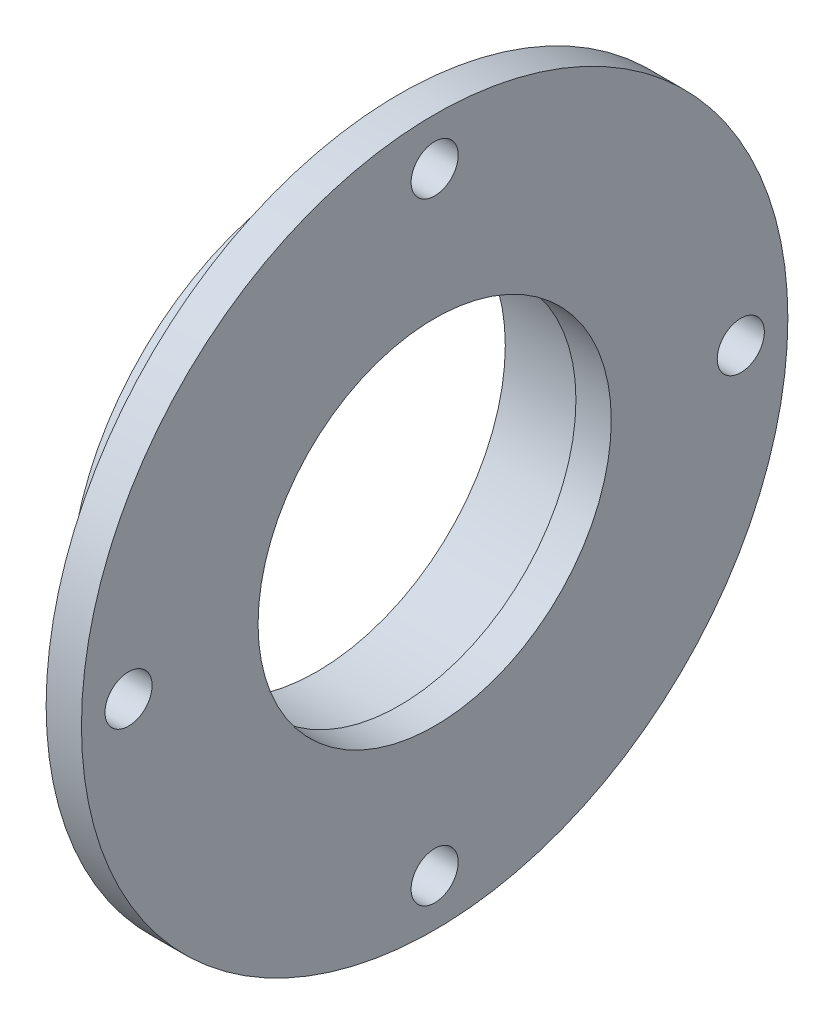
ISO-10303-21;
HEADER;
FILE_DESCRIPTION(('STEP AP214'),'2;1');
FILE_NAME('part.step','',(''),(''),'','','');
FILE_SCHEMA(('AUTOMOTIVE_DESIGN { 1 0 10303 214 1 1 1 1 }'));
ENDSEC;
DATA;
#1=APPLICATION_CONTEXT('core data for automotive mechanical design processes');
#2=APPLICATION_PROTOCOL_DEFINITION('international standard','automotive_design',2000,#1);
#3=PRODUCT_CONTEXT('',#1,'mechanical');
#4=PRODUCT('Part','Part','',(#3));
#5=PRODUCT_RELATED_PRODUCT_CATEGORY('part','',(#4));
#6=PRODUCT_DEFINITION_FORMATION('','',#4);
#7=PRODUCT_DEFINITION_CONTEXT('part definition',#1,'design');
#8=PRODUCT_DEFINITION('design','',#6,#7);
#9=PRODUCT_DEFINITION_SHAPE('','',#8);
#10=(LENGTH_UNIT() NAMED_UNIT(*) SI_UNIT(.MILLI.,.METRE.));
#11=(NAMED_UNIT(*) PLANE_ANGLE_UNIT() SI_UNIT($,.RADIAN.));
#12=(NAMED_UNIT(*) SI_UNIT($,.STERADIAN.) SOLID_ANGLE_UNIT());
#13=UNCERTAINTY_MEASURE_WITH_UNIT(LENGTH_MEASURE(1.E-05),#10,'distance_accuracy_value','');
#14=(GEOMETRIC_REPRESENTATION_CONTEXT(3) GLOBAL_UNCERTAINTY_ASSIGNED_CONTEXT((#13)) GLOBAL_UNIT_ASSIGNED_CONTEXT((#10,
#11,#12)) REPRESENTATION_CONTEXT('',''));
#15=CARTESIAN_POINT('',(0.,0.,0.));
#16=DIRECTION('',(0.,0.,1.));
#17=DIRECTION('',(1.,0.,0.));
#18=AXIS2_PLACEMENT_3D('',#15,#16,#17);
#19=CARTESIAN_POINT('',(10.,0.,0.));
#20=DIRECTION('',(-1.,0.,0.));
#21=DIRECTION('',(0.,0.,1.));
#22=AXIS2_PLACEMENT_3D('',#19,#20,#21);
#23=CYLINDRICAL_SURFACE('',#22,16.);
#24=CARTESIAN_POINT('',(0.,0.,0.));
#25=DIRECTION('',(-1.,0.,0.));
#26=DIRECTION('',(0.,0.,1.));
#27=AXIS2_PLACEMENT_3D('',#24,#25,#26);
#28=CIRCLE('',#27,16.);
#29=CARTESIAN_POINT('',(0.,0.,16.));
#30=VERTEX_POINT('',#29);
#31=EDGE_CURVE('E62',#30,#30,#28,.T.);
#32=ORIENTED_EDGE('',*,*,#31,.T.);
#33=EDGE_LOOP('',(#32));
#34=FACE_BOUND('',#33,.T.);
#35=CARTESIAN_POINT('',(7.,0.,0.));
#36=DIRECTION('',(1.,0.,0.));
#37=DIRECTION('',(0.,0.,-1.));
#38=AXIS2_PLACEMENT_3D('',#35,#36,#37);
#39=CIRCLE('',#38,16.);
#40=CARTESIAN_POINT('',(7.,0.,-16.));
#41=VERTEX_POINT('',#40);
#42=EDGE_CURVE('E10',#41,#41,#39,.F.);
#43=ORIENTED_EDGE('',*,*,#42,.F.);
#44=EDGE_LOOP('',(#43));
#45=FACE_BOUND('',#44,.T.);
#46=ADVANCED_FACE('F41',(#34,#45),#23,.F.);
#47=CARTESIAN_POINT('',(7.,0.,0.));
#48=DIRECTION('',(-1.,0.,0.));
#49=DIRECTION('',(0.,0.,1.));
#50=AXIS2_PLACEMENT_3D('',#47,#48,#49);
#51=CYLINDRICAL_SURFACE('',#50,21.);
#52=CARTESIAN_POINT('',(7.,0.,0.));
#53=DIRECTION('',(1.,0.,0.));
#54=DIRECTION('',(0.,0.,-1.));
#55=AXIS2_PLACEMENT_3D('',#52,#53,#54);
#56=CIRCLE('',#55,21.);
#57=CARTESIAN_POINT('',(7.,0.,-21.));
#58=VERTEX_POINT('',#57);
#59=EDGE_CURVE('E48',#58,#58,#56,.T.);
#60=ORIENTED_EDGE('',*,*,#59,.F.);
#61=EDGE_LOOP('',(#60));
#62=FACE_BOUND('',#61,.T.);
#63=CARTESIAN_POINT('',(0.,0.,0.));
#64=DIRECTION('',(1.,0.,0.));
#65=DIRECTION('',(0.,0.,-1.));
#66=AXIS2_PLACEMENT_3D('',#63,#64,#65);
#67=CIRCLE('',#66,21.);
#68=CARTESIAN_POINT('',(0.,0.,-21.));
#69=VERTEX_POINT('',#68);
#70=EDGE_CURVE('E52',#69,#69,#67,.T.);
#71=ORIENTED_EDGE('',*,*,#70,.T.);
#72=EDGE_LOOP('',(#71));
#73=FACE_BOUND('',#72,.T.);
#74=ADVANCED_FACE('F43',(#62,#73),#51,.T.);
#75=CARTESIAN_POINT('',(0.,0.,0.));
#76=DIRECTION('',(1.,0.,0.));
#77=DIRECTION('',(0.,0.,-1.));
#78=AXIS2_PLACEMENT_3D('',#75,#76,#77);
#79=PLANE('',#78);
#80=CARTESIAN_POINT('',(0.,18.5,0.));
#81=DIRECTION('',(-1.,0.,0.));
#82=DIRECTION('',(0.,0.,1.));
#83=AXIS2_PLACEMENT_3D('',#80,#81,#82);
#84=CIRCLE('',#83,1.5);
#85=CARTESIAN_POINT('',(0.,18.5,1.5));
#86=VERTEX_POINT('',#85);
#87=EDGE_CURVE('E87',#86,#86,#84,.T.);
#88=ORIENTED_EDGE('',*,*,#87,.F.);
#89=EDGE_LOOP('',(#88));
#90=FACE_BOUND('',#89,.T.);
#91=CARTESIAN_POINT('',(0.,0.,18.5));
#92=DIRECTION('',(-1.,0.,0.));
#93=DIRECTION('',(0.,0.,1.));
#94=AXIS2_PLACEMENT_3D('',#91,#92,#93);
#95=CIRCLE('',#94,1.5);
#96=CARTESIAN_POINT('',(0.,0.,20.));
#97=VERTEX_POINT('',#96);
#98=EDGE_CURVE('E84',#97,#97,#95,.T.);
#99=ORIENTED_EDGE('',*,*,#98,.F.);
#100=EDGE_LOOP('',(#99));
#101=FACE_BOUND('',#100,.T.);
#102=CARTESIAN_POINT('',(0.,-18.5,0.));
#103=DIRECTION('',(-1.,0.,0.));
#104=DIRECTION('',(0.,0.,1.));
#105=AXIS2_PLACEMENT_3D('',#102,#103,#104);
#106=CIRCLE('',#105,1.5);
#107=CARTESIAN_POINT('',(0.,-18.5,1.5));
#108=VERTEX_POINT('',#107);
#109=EDGE_CURVE('E78',#108,#108,#106,.T.);
#110=ORIENTED_EDGE('',*,*,#109,.F.);
#111=EDGE_LOOP('',(#110));
#112=FACE_BOUND('',#111,.T.);
#113=CARTESIAN_POINT('',(0.,0.,-18.5));
#114=DIRECTION('',(-1.,0.,0.));
#115=DIRECTION('',(0.,0.,1.));
#116=AXIS2_PLACEMENT_3D('',#113,#114,#115);
#117=CIRCLE('',#116,1.5);
#118=CARTESIAN_POINT('',(0.,0.,-17.));
#119=VERTEX_POINT('',#118);
#120=EDGE_CURVE('E71',#119,#119,#117,.T.);
#121=ORIENTED_EDGE('',*,*,#120,.F.);
#122=EDGE_LOOP('',(#121));
#123=FACE_BOUND('',#122,.T.);
#124=ORIENTED_EDGE('',*,*,#31,.F.);
#125=EDGE_LOOP('',(#124));
#126=FACE_BOUND('',#125,.T.);
#127=ORIENTED_EDGE('',*,*,#70,.F.);
#128=EDGE_LOOP('',(#127));
#129=FACE_BOUND('',#128,.T.);
#130=ADVANCED_FACE('F147',(#90,#101,#112,#123,#126,#129),#79,.F.);
#131=CARTESIAN_POINT('',(10.,0.,0.));
#132=DIRECTION('',(-1.,0.,0.));
#133=DIRECTION('',(0.,0.,1.));
#134=AXIS2_PLACEMENT_3D('',#131,#132,#133);
#135=CYLINDRICAL_SURFACE('',#134,30.);
#136=CARTESIAN_POINT('',(10.,0.,0.));
#137=DIRECTION('',(1.,0.,0.));
#138=DIRECTION('',(0.,0.,-1.));
#139=AXIS2_PLACEMENT_3D('',#136,#137,#138);
#140=CIRCLE('',#139,30.);
#141=CARTESIAN_POINT('',(10.,0.,-30.));
#142=VERTEX_POINT('',#141);
#143=EDGE_CURVE('E57',#142,#142,#140,.T.);
#144=ORIENTED_EDGE('',*,*,#143,.F.);
#145=EDGE_LOOP('',(#144));
#146=FACE_BOUND('',#145,.T.);
#147=CARTESIAN_POINT('',(7.,0.,0.));
#148=DIRECTION('',(1.,0.,0.));
#149=DIRECTION('',(0.,0.,-1.));
#150=AXIS2_PLACEMENT_3D('',#147,#148,#149);
#151=CIRCLE('',#150,30.);
#152=CARTESIAN_POINT('',(7.,0.,-30.));
#153=VERTEX_POINT('',#152);
#154=EDGE_CURVE('E59',#153,#153,#151,.T.);
#155=ORIENTED_EDGE('',*,*,#154,.T.);
#156=EDGE_LOOP('',(#155));
#157=FACE_BOUND('',#156,.T.);
#158=ADVANCED_FACE('F145',(#146,#157),#135,.T.);
#159=CARTESIAN_POINT('',(10.,0.,0.));
#160=DIRECTION('',(1.,0.,0.));
#161=DIRECTION('',(0.,0.,-1.));
#162=AXIS2_PLACEMENT_3D('',#159,#160,#161);
#163=PLANE('',#162);
#164=CARTESIAN_POINT('',(10.,26.,0.));
#165=DIRECTION('',(-1.,0.,0.));
#166=DIRECTION('',(0.,0.,1.));
#167=AXIS2_PLACEMENT_3D('',#164,#165,#166);
#168=CIRCLE('',#167,2.);
#169=CARTESIAN_POINT('',(10.,26.,2.));
#170=VERTEX_POINT('',#169);
#171=EDGE_CURVE('E95',#170,#170,#168,.T.);
#172=ORIENTED_EDGE('',*,*,#171,.T.);
#173=EDGE_LOOP('',(#172));
#174=FACE_BOUND('',#173,.T.);
#175=CARTESIAN_POINT('',(10.,0.,26.));
#176=DIRECTION('',(-1.,0.,0.));
#177=DIRECTION('',(0.,0.,1.));
#178=AXIS2_PLACEMENT_3D('',#175,#176,#177);
#179=CIRCLE('',#178,2.);
#180=CARTESIAN_POINT('',(10.,0.,28.));
#181=VERTEX_POINT('',#180);
#182=EDGE_CURVE('E110',#181,#181,#179,.T.);
#183=ORIENTED_EDGE('',*,*,#182,.T.);
#184=EDGE_LOOP('',(#183));
#185=FACE_BOUND('',#184,.T.);
#186=CARTESIAN_POINT('',(10.,-26.,0.));
#187=DIRECTION('',(-1.,0.,0.));
#188=DIRECTION('',(0.,0.,1.));
#189=AXIS2_PLACEMENT_3D('',#186,#187,#188);
#190=CIRCLE('',#189,2.);
#191=CARTESIAN_POINT('',(10.,-26.,2.));
#192=VERTEX_POINT('',#191);
#193=EDGE_CURVE('E104',#192,#192,#190,.T.);
#194=ORIENTED_EDGE('',*,*,#193,.T.);
#195=EDGE_LOOP('',(#194));
#196=FACE_BOUND('',#195,.T.);
#197=CARTESIAN_POINT('',(10.,0.,-26.));
#198=DIRECTION('',(-1.,0.,0.));
#199=DIRECTION('',(0.,0.,1.));
#200=AXIS2_PLACEMENT_3D('',#197,#198,#199);
#201=CIRCLE('',#200,2.);
#202=CARTESIAN_POINT('',(10.,0.,-24.));
#203=VERTEX_POINT('',#202);
#204=EDGE_CURVE('E98',#203,#203,#201,.T.);
#205=ORIENTED_EDGE('',*,*,#204,.T.);
#206=EDGE_LOOP('',(#205));
#207=FACE_BOUND('',#206,.T.);
#208=ORIENTED_EDGE('',*,*,#143,.T.);
#209=EDGE_LOOP('',(#208));
#210=FACE_BOUND('',#209,.T.);
#211=CARTESIAN_POINT('',(10.,0.,0.));
#212=DIRECTION('',(1.,0.,0.));
#213=DIRECTION('',(0.,0.,-1.));
#214=AXIS2_PLACEMENT_3D('',#211,#212,#213);
#215=CIRCLE('',#214,15.);
#216=CARTESIAN_POINT('',(10.,0.,-15.));
#217=VERTEX_POINT('',#216);
#218=EDGE_CURVE('E92',#217,#217,#215,.T.);
#219=ORIENTED_EDGE('',*,*,#218,.F.);
#220=EDGE_LOOP('',(#219));
#221=FACE_BOUND('',#220,.T.);
#222=ADVANCED_FACE('F122',(#174,#185,#196,#207,#210,#221),#163,.T.);
#223=CARTESIAN_POINT('',(7.,0.,0.));
#224=DIRECTION('',(1.,0.,0.));
#225=DIRECTION('',(0.,0.,-1.));
#226=AXIS2_PLACEMENT_3D('',#223,#224,#225);
#227=PLANE('',#226);
#228=CARTESIAN_POINT('',(7.,26.,0.));
#229=DIRECTION('',(-1.,0.,0.));
#230=DIRECTION('',(0.,0.,1.));
#231=AXIS2_PLACEMENT_3D('',#228,#229,#230);
#232=CIRCLE('',#231,2.);
#233=CARTESIAN_POINT('',(7.,26.,2.));
#234=VERTEX_POINT('',#233);
#235=EDGE_CURVE('E116',#234,#234,#232,.T.);
#236=ORIENTED_EDGE('',*,*,#235,.F.);
#237=EDGE_LOOP('',(#236));
#238=FACE_BOUND('',#237,.T.);
#239=CARTESIAN_POINT('',(7.,0.,26.));
#240=DIRECTION('',(-1.,0.,0.));
#241=DIRECTION('',(0.,0.,1.));
#242=AXIS2_PLACEMENT_3D('',#239,#240,#241);
#243=CIRCLE('',#242,2.);
#244=CARTESIAN_POINT('',(7.,0.,28.));
#245=VERTEX_POINT('',#244);
#246=EDGE_CURVE('E113',#245,#245,#243,.T.);
#247=ORIENTED_EDGE('',*,*,#246,.F.);
#248=EDGE_LOOP('',(#247));
#249=FACE_BOUND('',#248,.T.);
#250=CARTESIAN_POINT('',(7.,-26.,0.));
#251=DIRECTION('',(-1.,0.,0.));
#252=DIRECTION('',(0.,0.,1.));
#253=AXIS2_PLACEMENT_3D('',#250,#251,#252);
#254=CIRCLE('',#253,2.);
#255=CARTESIAN_POINT('',(7.,-26.,2.));
#256=VERTEX_POINT('',#255);
#257=EDGE_CURVE('E107',#256,#256,#254,.T.);
#258=ORIENTED_EDGE('',*,*,#257,.F.);
#259=EDGE_LOOP('',(#258));
#260=FACE_BOUND('',#259,.T.);
#261=CARTESIAN_POINT('',(7.,0.,-26.));
#262=DIRECTION('',(-1.,0.,0.));
#263=DIRECTION('',(0.,0.,1.));
#264=AXIS2_PLACEMENT_3D('',#261,#262,#263);
#265=CIRCLE('',#264,2.);
#266=CARTESIAN_POINT('',(7.,0.,-24.));
#267=VERTEX_POINT('',#266);
#268=EDGE_CURVE('E101',#267,#267,#265,.T.);
#269=ORIENTED_EDGE('',*,*,#268,.F.);
#270=EDGE_LOOP('',(#269));
#271=FACE_BOUND('',#270,.T.);
#272=ORIENTED_EDGE('',*,*,#59,.T.);
#273=EDGE_LOOP('',(#272));
#274=FACE_BOUND('',#273,.T.);
#275=ORIENTED_EDGE('',*,*,#154,.F.);
#276=EDGE_LOOP('',(#275));
#277=FACE_BOUND('',#276,.T.);
#278=ADVANCED_FACE('F132',(#238,#249,#260,#271,#274,#277),#227,.F.);
#279=CARTESIAN_POINT('',(5.,0.,-18.5));
#280=DIRECTION('',(-1.,0.,0.));
#281=DIRECTION('',(0.,0.,1.));
#282=AXIS2_PLACEMENT_3D('',#279,#280,#281);
#283=CYLINDRICAL_SURFACE('',#282,1.5);
#284=CARTESIAN_POINT('',(5.,0.,-18.5));
#285=DIRECTION('',(-1.,0.,0.));
#286=DIRECTION('',(0.,0.,1.));
#287=AXIS2_PLACEMENT_3D('',#284,#285,#286);
#288=CIRCLE('',#287,1.5);
#289=CARTESIAN_POINT('',(5.,0.,-17.));
#290=VERTEX_POINT('',#289);
#291=EDGE_CURVE('E68',#290,#290,#288,.T.);
#292=ORIENTED_EDGE('',*,*,#291,.F.);
#293=EDGE_LOOP('',(#292));
#294=FACE_BOUND('',#293,.T.);
#295=ORIENTED_EDGE('',*,*,#120,.T.);
#296=EDGE_LOOP('',(#295));
#297=FACE_BOUND('',#296,.T.);
#298=ADVANCED_FACE('F135',(#294,#297),#283,.F.);
#299=CARTESIAN_POINT('',(5.,0.,-18.5));
#300=DIRECTION('',(-1.,0.,0.));
#301=DIRECTION('',(0.,0.,1.));
#302=AXIS2_PLACEMENT_3D('',#299,#300,#301);
#303=PLANE('',#302);
#304=ORIENTED_EDGE('',*,*,#291,.T.);
#305=EDGE_LOOP('',(#304));
#306=FACE_BOUND('',#305,.T.);
#307=ADVANCED_FACE('F168',(#306),#303,.T.);
#308=CARTESIAN_POINT('',(5.,-18.5,0.));
#309=DIRECTION('',(-1.,0.,0.));
#310=DIRECTION('',(0.,0.,1.));
#311=AXIS2_PLACEMENT_3D('',#308,#309,#310);
#312=CYLINDRICAL_SURFACE('',#311,1.5);
#313=CARTESIAN_POINT('',(5.,-18.5,0.));
#314=DIRECTION('',(-1.,0.,0.));
#315=DIRECTION('',(0.,0.,1.));
#316=AXIS2_PLACEMENT_3D('',#313,#314,#315);
#317=CIRCLE('',#316,1.5);
#318=CARTESIAN_POINT('',(5.,-18.5,1.5));
#319=VERTEX_POINT('',#318);
#320=EDGE_CURVE('E75',#319,#319,#317,.T.);
#321=ORIENTED_EDGE('',*,*,#320,.F.);
#322=EDGE_LOOP('',(#321));
#323=FACE_BOUND('',#322,.T.);
#324=ORIENTED_EDGE('',*,*,#109,.T.);
#325=EDGE_LOOP('',(#324));
#326=FACE_BOUND('',#325,.T.);
#327=ADVANCED_FACE('F171',(#323,#326),#312,.F.);
#328=CARTESIAN_POINT('',(5.,-18.5,0.));
#329=DIRECTION('',(-1.,0.,0.));
#330=DIRECTION('',(0.,0.,1.));
#331=AXIS2_PLACEMENT_3D('',#328,#329,#330);
#332=PLANE('',#331);
#333=ORIENTED_EDGE('',*,*,#320,.T.);
#334=EDGE_LOOP('',(#333));
#335=FACE_BOUND('',#334,.T.);
#336=ADVANCED_FACE('F176',(#335),#332,.T.);
#337=CARTESIAN_POINT('',(5.,0.,18.5));
#338=DIRECTION('',(-1.,0.,0.));
#339=DIRECTION('',(0.,0.,1.));
#340=AXIS2_PLACEMENT_3D('',#337,#338,#339);
#341=CYLINDRICAL_SURFACE('',#340,1.5);
#342=CARTESIAN_POINT('',(5.,0.,18.5));
#343=DIRECTION('',(-1.,0.,0.));
#344=DIRECTION('',(0.,0.,1.));
#345=AXIS2_PLACEMENT_3D('',#342,#343,#344);
#346=CIRCLE('',#345,1.5);
#347=CARTESIAN_POINT('',(5.,0.,20.));
#348=VERTEX_POINT('',#347);
#349=EDGE_CURVE('E81',#348,#348,#346,.T.);
#350=ORIENTED_EDGE('',*,*,#349,.F.);
#351=EDGE_LOOP('',(#350));
#352=FACE_BOUND('',#351,.T.);
#353=ORIENTED_EDGE('',*,*,#98,.T.);
#354=EDGE_LOOP('',(#353));
#355=FACE_BOUND('',#354,.T.);
#356=ADVANCED_FACE('F179',(#352,#355),#341,.F.);
#357=CARTESIAN_POINT('',(5.,0.,18.5));
#358=DIRECTION('',(-1.,0.,0.));
#359=DIRECTION('',(0.,0.,1.));
#360=AXIS2_PLACEMENT_3D('',#357,#358,#359);
#361=PLANE('',#360);
#362=ORIENTED_EDGE('',*,*,#349,.T.);
#363=EDGE_LOOP('',(#362));
#364=FACE_BOUND('',#363,.T.);
#365=ADVANCED_FACE('F184',(#364),#361,.T.);
#366=CARTESIAN_POINT('',(5.,18.5,0.));
#367=DIRECTION('',(-1.,0.,0.));
#368=DIRECTION('',(0.,0.,1.));
#369=AXIS2_PLACEMENT_3D('',#366,#367,#368);
#370=CYLINDRICAL_SURFACE('',#369,1.5);
#371=CARTESIAN_POINT('',(5.,18.5,0.));
#372=DIRECTION('',(-1.,0.,0.));
#373=DIRECTION('',(0.,0.,1.));
#374=AXIS2_PLACEMENT_3D('',#371,#372,#373);
#375=CIRCLE('',#374,1.5);
#376=CARTESIAN_POINT('',(5.,18.5,1.5));
#377=VERTEX_POINT('',#376);
#378=EDGE_CURVE('E67',#377,#377,#375,.T.);
#379=ORIENTED_EDGE('',*,*,#378,.F.);
#380=EDGE_LOOP('',(#379));
#381=FACE_BOUND('',#380,.T.);
#382=ORIENTED_EDGE('',*,*,#87,.T.);
#383=EDGE_LOOP('',(#382));
#384=FACE_BOUND('',#383,.T.);
#385=ADVANCED_FACE('F187',(#381,#384),#370,.F.);
#386=CARTESIAN_POINT('',(5.,18.5,0.));
#387=DIRECTION('',(-1.,0.,0.));
#388=DIRECTION('',(0.,0.,1.));
#389=AXIS2_PLACEMENT_3D('',#386,#387,#388);
#390=PLANE('',#389);
#391=ORIENTED_EDGE('',*,*,#378,.T.);
#392=EDGE_LOOP('',(#391));
#393=FACE_BOUND('',#392,.T.);
#394=ADVANCED_FACE('F194',(#393),#390,.T.);
#395=CARTESIAN_POINT('',(7.,0.,0.));
#396=DIRECTION('',(1.,0.,0.));
#397=DIRECTION('',(0.,0.,-1.));
#398=AXIS2_PLACEMENT_3D('',#395,#396,#397);
#399=PLANE('',#398);
#400=CARTESIAN_POINT('',(7.,0.,0.));
#401=DIRECTION('',(1.,0.,0.));
#402=DIRECTION('',(0.,0.,-1.));
#403=AXIS2_PLACEMENT_3D('',#400,#401,#402);
#404=CIRCLE('',#403,15.);
#405=CARTESIAN_POINT('',(7.,0.,-15.));
#406=VERTEX_POINT('',#405);
#407=EDGE_CURVE('E72',#406,#406,#404,.T.);
#408=ORIENTED_EDGE('',*,*,#407,.T.);
#409=EDGE_LOOP('',(#408));
#410=FACE_BOUND('',#409,.T.);
#411=ORIENTED_EDGE('',*,*,#42,.T.);
#412=EDGE_LOOP('',(#411));
#413=FACE_BOUND('',#412,.T.);
#414=ADVANCED_FACE('F197',(#410,#413),#399,.F.);
#415=CARTESIAN_POINT('',(7.,0.,0.));
#416=DIRECTION('',(1.,0.,0.));
#417=DIRECTION('',(0.,0.,-1.));
#418=AXIS2_PLACEMENT_3D('',#415,#416,#417);
#419=CYLINDRICAL_SURFACE('',#418,15.);
#420=ORIENTED_EDGE('',*,*,#407,.F.);
#421=EDGE_LOOP('',(#420));
#422=FACE_BOUND('',#421,.T.);
#423=ORIENTED_EDGE('',*,*,#218,.T.);
#424=EDGE_LOOP('',(#423));
#425=FACE_BOUND('',#424,.T.);
#426=ADVANCED_FACE('F200',(#422,#425),#419,.F.);
#427=CARTESIAN_POINT('',(10.,0.,-26.));
#428=DIRECTION('',(-1.,0.,0.));
#429=DIRECTION('',(0.,0.,1.));
#430=AXIS2_PLACEMENT_3D('',#427,#428,#429);
#431=CYLINDRICAL_SURFACE('',#430,2.);
#432=ORIENTED_EDGE('',*,*,#204,.F.);
#433=EDGE_LOOP('',(#432));
#434=FACE_BOUND('',#433,.T.);
#435=ORIENTED_EDGE('',*,*,#268,.T.);
#436=EDGE_LOOP('',(#435));
#437=FACE_BOUND('',#436,.T.);
#438=ADVANCED_FACE('F204',(#434,#437),#431,.F.);
#439=CARTESIAN_POINT('',(10.,-26.,0.));
#440=DIRECTION('',(-1.,0.,0.));
#441=DIRECTION('',(0.,0.,1.));
#442=AXIS2_PLACEMENT_3D('',#439,#440,#441);
#443=CYLINDRICAL_SURFACE('',#442,2.);
#444=ORIENTED_EDGE('',*,*,#193,.F.);
#445=EDGE_LOOP('',(#444));
#446=FACE_BOUND('',#445,.T.);
#447=ORIENTED_EDGE('',*,*,#257,.T.);
#448=EDGE_LOOP('',(#447));
#449=FACE_BOUND('',#448,.T.);
#450=ADVANCED_FACE('F208',(#446,#449),#443,.F.);
#451=CARTESIAN_POINT('',(10.,0.,26.));
#452=DIRECTION('',(-1.,0.,0.));
#453=DIRECTION('',(0.,0.,1.));
#454=AXIS2_PLACEMENT_3D('',#451,#452,#453);
#455=CYLINDRICAL_SURFACE('',#454,2.);
#456=ORIENTED_EDGE('',*,*,#182,.F.);
#457=EDGE_LOOP('',(#456));
#458=FACE_BOUND('',#457,.T.);
#459=ORIENTED_EDGE('',*,*,#246,.T.);
#460=EDGE_LOOP('',(#459));
#461=FACE_BOUND('',#460,.T.);
#462=ADVANCED_FACE('F128',(#458,#461),#455,.F.);
#463=CARTESIAN_POINT('',(10.,26.,0.));
#464=DIRECTION('',(-1.,0.,0.));
#465=DIRECTION('',(0.,0.,1.));
#466=AXIS2_PLACEMENT_3D('',#463,#464,#465);
#467=CYLINDRICAL_SURFACE('',#466,2.);
#468=ORIENTED_EDGE('',*,*,#171,.F.);
#469=EDGE_LOOP('',(#468));
#470=FACE_BOUND('',#469,.T.);
#471=ORIENTED_EDGE('',*,*,#235,.T.);
#472=EDGE_LOOP('',(#471));
#473=FACE_BOUND('',#472,.T.);
#474=ADVANCED_FACE('F125',(#470,#473),#467,.F.);
#475=CLOSED_SHELL('',(#46,#74,#130,#158,#222,#278,#298,#307,#327,#336,#356,#365,#385,#394,#414,
#426,#438,#450,#462,#474));
#476=MANIFOLD_SOLID_BREP('B2',#475);
#477=ADVANCED_BREP_SHAPE_REPRESENTATION('',(#18,#476),#14);
#478=SHAPE_DEFINITION_REPRESENTATION(#9,#477);
ENDSEC;
END-ISO-10303-21;
